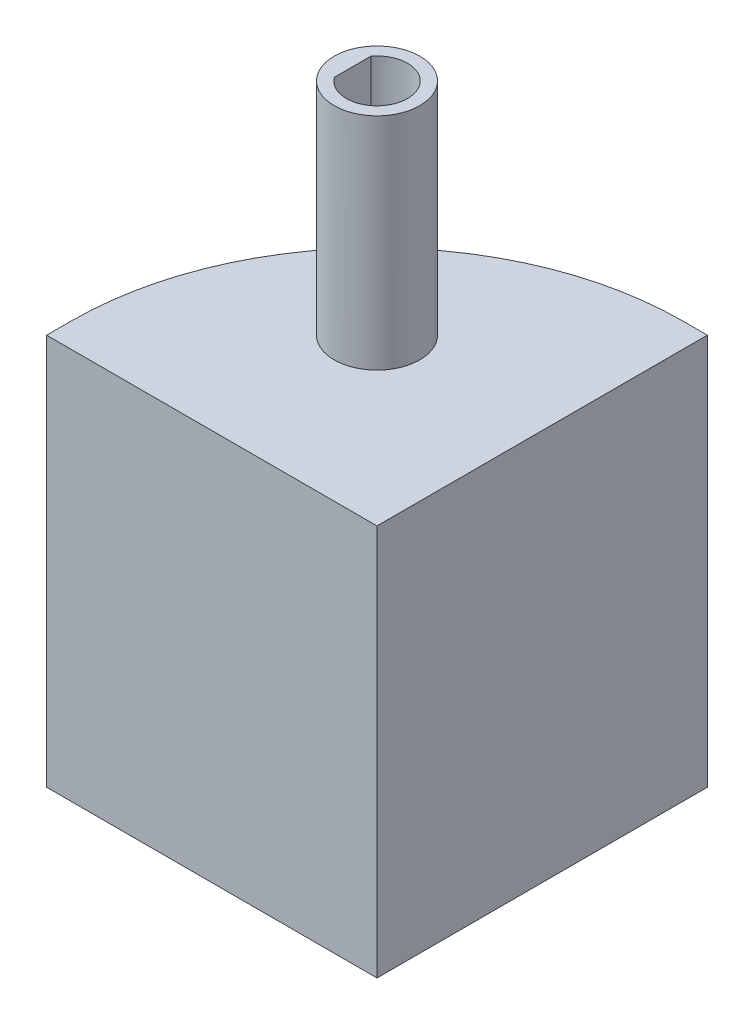
ISO-10303-21;
HEADER;
FILE_DESCRIPTION(('STEP AP214'),'2;1');
FILE_NAME('part.step','',(''),(''),'','','');
FILE_SCHEMA(('AUTOMOTIVE_DESIGN { 1 0 10303 214 1 1 1 1 }'));
ENDSEC;
DATA;
#1=APPLICATION_CONTEXT('core data for automotive mechanical design processes');
#2=APPLICATION_PROTOCOL_DEFINITION('international standard','automotive_design',2000,#1);
#3=PRODUCT_CONTEXT('',#1,'mechanical');
#4=PRODUCT('Part','Part','',(#3));
#5=PRODUCT_RELATED_PRODUCT_CATEGORY('part','',(#4));
#6=PRODUCT_DEFINITION_FORMATION('','',#4);
#7=PRODUCT_DEFINITION_CONTEXT('part definition',#1,'design');
#8=PRODUCT_DEFINITION('design','',#6,#7);
#9=PRODUCT_DEFINITION_SHAPE('','',#8);
#10=(LENGTH_UNIT() NAMED_UNIT(*) SI_UNIT(.MILLI.,.METRE.));
#11=(NAMED_UNIT(*) PLANE_ANGLE_UNIT() SI_UNIT($,.RADIAN.));
#12=(NAMED_UNIT(*) SI_UNIT($,.STERADIAN.) SOLID_ANGLE_UNIT());
#13=UNCERTAINTY_MEASURE_WITH_UNIT(LENGTH_MEASURE(1.E-05),#10,'distance_accuracy_value','');
#14=(GEOMETRIC_REPRESENTATION_CONTEXT(3) GLOBAL_UNCERTAINTY_ASSIGNED_CONTEXT((#13)) GLOBAL_UNIT_ASSIGNED_CONTEXT((#10,
#11,#12)) REPRESENTATION_CONTEXT('',''));
#15=CARTESIAN_POINT('',(0.,0.,0.));
#16=DIRECTION('',(0.,0.,1.));
#17=DIRECTION('',(1.,0.,0.));
#18=AXIS2_PLACEMENT_3D('',#15,#16,#17);
#19=CARTESIAN_POINT('',(0.,32.,0.));
#20=DIRECTION('',(0.,-1.,0.));
#21=DIRECTION('',(0.,0.,-1.));
#22=AXIS2_PLACEMENT_3D('',#19,#20,#21);
#23=PLANE('',#22);
#24=DIRECTION('',(1.,0.,0.));
#25=VECTOR('',#24,1.);
#26=CARTESIAN_POINT('',(27.,32.,-25.));
#27=LINE('',#26,#25);
#28=CARTESIAN_POINT('',(25.,32.,-25.));
#29=VERTEX_POINT('',#28);
#30=CARTESIAN_POINT('',(27.,32.,-25.));
#31=VERTEX_POINT('',#30);
#32=EDGE_CURVE('E186',#29,#31,#27,.T.);
#33=ORIENTED_EDGE('',*,*,#32,.F.);
#34=CARTESIAN_POINT('',(25.0000000000001,32.,0.));
#35=DIRECTION('',(0.,1.,0.));
#36=DIRECTION('',(0.,0.,-1.));
#37=AXIS2_PLACEMENT_3D('',#34,#35,#36);
#38=CIRCLE('',#37,25.0000000000001);
#39=CARTESIAN_POINT('',(0.,32.,0.));
#40=VERTEX_POINT('',#39);
#41=EDGE_CURVE('E175',#29,#40,#38,.T.);
#42=ORIENTED_EDGE('',*,*,#41,.T.);
#43=DIRECTION('',(0.,0.,-1.));
#44=VECTOR('',#43,1.);
#45=CARTESIAN_POINT('',(0.,32.,0.));
#46=LINE('',#45,#44);
#47=CARTESIAN_POINT('',(0.,32.,2.));
#48=VERTEX_POINT('',#47);
#49=EDGE_CURVE('E196',#48,#40,#46,.T.);
#50=ORIENTED_EDGE('',*,*,#49,.F.);
#51=DIRECTION('',(-1.,0.,0.));
#52=VECTOR('',#51,1.);
#53=CARTESIAN_POINT('',(0.,32.,2.));
#54=LINE('',#53,#52);
#55=CARTESIAN_POINT('',(27.,32.,2.));
#56=VERTEX_POINT('',#55);
#57=EDGE_CURVE('E193',#56,#48,#54,.T.);
#58=ORIENTED_EDGE('',*,*,#57,.F.);
#59=DIRECTION('',(0.,0.,1.));
#60=VECTOR('',#59,1.);
#61=CARTESIAN_POINT('',(27.,32.,2.));
#62=LINE('',#61,#60);
#63=EDGE_CURVE('E189',#31,#56,#62,.T.);
#64=ORIENTED_EDGE('',*,*,#63,.F.);
#65=EDGE_LOOP('',(#33,#42,#50,#58,#64));
#66=FACE_BOUND('',#65,.T.);
#67=CARTESIAN_POINT('',(13.5,32.,-11.5));
#68=DIRECTION('',(0.,-1.,0.));
#69=DIRECTION('',(0.,0.,-1.));
#70=AXIS2_PLACEMENT_3D('',#67,#68,#69);
#71=CIRCLE('',#70,3.5);
#72=CARTESIAN_POINT('',(13.5,32.,-15.));
#73=VERTEX_POINT('',#72);
#74=EDGE_CURVE('E12',#73,#73,#71,.F.);
#75=ORIENTED_EDGE('',*,*,#74,.F.);
#76=EDGE_LOOP('',(#75));
#77=FACE_BOUND('',#76,.T.);
#78=ADVANCED_FACE('F57',(#66,#77),#23,.F.);
#79=CARTESIAN_POINT('',(0.,0.,-25.));
#80=DIRECTION('',(0.,-1.,0.));
#81=DIRECTION('',(0.,0.,-1.));
#82=AXIS2_PLACEMENT_3D('',#79,#80,#81);
#83=PLANE('',#82);
#84=CARTESIAN_POINT('',(12.5,0.,-12.5));
#85=DIRECTION('',(0.,1.,0.));
#86=DIRECTION('',(0.,0.,1.));
#87=AXIS2_PLACEMENT_3D('',#84,#85,#86);
#88=CIRCLE('',#87,6.0005);
#89=CARTESIAN_POINT('',(12.5,0.,-6.4995));
#90=VERTEX_POINT('',#89);
#91=EDGE_CURVE('E219',#90,#90,#88,.T.);
#92=ORIENTED_EDGE('',*,*,#91,.T.);
#93=EDGE_LOOP('',(#92));
#94=FACE_BOUND('',#93,.T.);
#95=DIRECTION('',(1.,0.,0.));
#96=VECTOR('',#95,1.);
#97=CARTESIAN_POINT('',(0.,0.,-7.5));
#98=LINE('',#97,#96);
#99=CARTESIAN_POINT('',(0.,0.,-7.5));
#100=VERTEX_POINT('',#99);
#101=CARTESIAN_POINT('',(3.83974596215561,0.,-7.5));
#102=VERTEX_POINT('',#101);
#103=EDGE_CURVE('E231',#100,#102,#98,.T.);
#104=ORIENTED_EDGE('',*,*,#103,.T.);
#105=CARTESIAN_POINT('',(12.5,0.,-12.5));
#106=DIRECTION('',(0.,1.,0.));
#107=DIRECTION('',(0.,0.,1.));
#108=AXIS2_PLACEMENT_3D('',#105,#106,#107);
#109=CIRCLE('',#108,10.);
#110=CARTESIAN_POINT('',(12.5,0.,-22.5));
#111=VERTEX_POINT('',#110);
#112=EDGE_CURVE('E225',#111,#102,#109,.T.);
#113=ORIENTED_EDGE('',*,*,#112,.F.);
#114=DIRECTION('',(0.,0.,-1.));
#115=VECTOR('',#114,1.);
#116=CARTESIAN_POINT('',(12.5,0.,0.));
#117=LINE('',#116,#115);
#118=CARTESIAN_POINT('',(12.5,0.,-25.));
#119=VERTEX_POINT('',#118);
#120=EDGE_CURVE('E227',#111,#119,#117,.T.);
#121=ORIENTED_EDGE('',*,*,#120,.T.);
#122=DIRECTION('',(1.,0.,0.));
#123=VECTOR('',#122,1.);
#124=CARTESIAN_POINT('',(0.,0.,-25.));
#125=LINE('',#124,#123);
#126=CARTESIAN_POINT('',(27.,0.,-25.));
#127=VERTEX_POINT('',#126);
#128=EDGE_CURVE('E250',#119,#127,#125,.T.);
#129=ORIENTED_EDGE('',*,*,#128,.T.);
#130=DIRECTION('',(0.,0.,1.));
#131=VECTOR('',#130,1.);
#132=CARTESIAN_POINT('',(27.,0.,2.));
#133=LINE('',#132,#131);
#134=CARTESIAN_POINT('',(27.,0.,2.));
#135=VERTEX_POINT('',#134);
#136=EDGE_CURVE('E183',#127,#135,#133,.T.);
#137=ORIENTED_EDGE('',*,*,#136,.T.);
#138=DIRECTION('',(-1.,0.,0.));
#139=VECTOR('',#138,1.);
#140=CARTESIAN_POINT('',(0.,0.,2.));
#141=LINE('',#140,#139);
#142=CARTESIAN_POINT('',(0.,0.,2.));
#143=VERTEX_POINT('',#142);
#144=EDGE_CURVE('E190',#135,#143,#141,.T.);
#145=ORIENTED_EDGE('',*,*,#144,.T.);
#146=DIRECTION('',(0.,0.,1.));
#147=VECTOR('',#146,1.);
#148=CARTESIAN_POINT('',(0.,0.,-25.));
#149=LINE('',#148,#147);
#150=EDGE_CURVE('E65',#100,#143,#149,.T.);
#151=ORIENTED_EDGE('',*,*,#150,.F.);
#152=EDGE_LOOP('',(#104,#113,#121,#129,#137,#145,#151));
#153=FACE_BOUND('',#152,.T.);
#154=ADVANCED_FACE('F59',(#94,#153),#83,.T.);
#155=CARTESIAN_POINT('',(0.,0.,-25.));
#156=DIRECTION('',(1.,0.,0.));
#157=DIRECTION('',(0.,0.,-1.));
#158=AXIS2_PLACEMENT_3D('',#155,#156,#157);
#159=PLANE('',#158);
#160=DIRECTION('',(0.,0.,1.));
#161=VECTOR('',#160,1.);
#162=CARTESIAN_POINT('',(0.,2.,-25.));
#163=LINE('',#162,#161);
#164=CARTESIAN_POINT('',(0.,2.,-7.5));
#165=VERTEX_POINT('',#164);
#166=CARTESIAN_POINT('',(0.,2.,0.));
#167=VERTEX_POINT('',#166);
#168=EDGE_CURVE('E259',#165,#167,#163,.T.);
#169=ORIENTED_EDGE('',*,*,#168,.F.);
#170=DIRECTION('',(0.,1.,0.));
#171=VECTOR('',#170,1.);
#172=CARTESIAN_POINT('',(0.,0.,-7.5));
#173=LINE('',#172,#171);
#174=EDGE_CURVE('E244',#100,#165,#173,.T.);
#175=ORIENTED_EDGE('',*,*,#174,.F.);
#176=ORIENTED_EDGE('',*,*,#150,.T.);
#177=DIRECTION('',(0.,-1.,0.));
#178=VECTOR('',#177,1.);
#179=CARTESIAN_POINT('',(0.,32.,2.));
#180=LINE('',#179,#178);
#181=EDGE_CURVE('E206',#48,#143,#180,.T.);
#182=ORIENTED_EDGE('',*,*,#181,.F.);
#183=ORIENTED_EDGE('',*,*,#49,.T.);
#184=DIRECTION('',(0.,-1.,0.));
#185=VECTOR('',#184,1.);
#186=CARTESIAN_POINT('',(0.,32.,0.));
#187=LINE('',#186,#185);
#188=CARTESIAN_POINT('',(0.,30.,0.));
#189=VERTEX_POINT('',#188);
#190=EDGE_CURVE('E203',#40,#189,#187,.T.);
#191=ORIENTED_EDGE('',*,*,#190,.T.);
#192=EDGE_CURVE('E80',#189,#167,#187,.T.);
#193=ORIENTED_EDGE('',*,*,#192,.T.);
#194=EDGE_LOOP('',(#169,#175,#176,#182,#183,#191,#193));
#195=FACE_BOUND('',#194,.T.);
#196=ADVANCED_FACE('F310',(#195),#159,.F.);
#197=CARTESIAN_POINT('',(0.,2.,-25.));
#198=DIRECTION('',(0.,-1.,0.));
#199=DIRECTION('',(0.,0.,-1.));
#200=AXIS2_PLACEMENT_3D('',#197,#198,#199);
#201=PLANE('',#200);
#202=CARTESIAN_POINT('',(12.5,2.,-12.5));
#203=DIRECTION('',(0.,1.,0.));
#204=DIRECTION('',(0.,0.,1.));
#205=AXIS2_PLACEMENT_3D('',#202,#203,#204);
#206=CIRCLE('',#205,6.0005);
#207=CARTESIAN_POINT('',(12.5,2.,-6.4995));
#208=VERTEX_POINT('',#207);
#209=EDGE_CURVE('E205',#208,#208,#206,.T.);
#210=ORIENTED_EDGE('',*,*,#209,.F.);
#211=EDGE_LOOP('',(#210));
#212=FACE_BOUND('',#211,.T.);
#213=CARTESIAN_POINT('',(12.5,2.,-12.5));
#214=DIRECTION('',(0.,1.,0.));
#215=DIRECTION('',(0.,0.,1.));
#216=AXIS2_PLACEMENT_3D('',#213,#214,#215);
#217=CIRCLE('',#216,10.);
#218=CARTESIAN_POINT('',(12.5,2.,-22.5));
#219=VERTEX_POINT('',#218);
#220=CARTESIAN_POINT('',(3.83974596215561,2.,-7.5));
#221=VERTEX_POINT('',#220);
#222=EDGE_CURVE('E222',#219,#221,#217,.T.);
#223=ORIENTED_EDGE('',*,*,#222,.T.);
#224=DIRECTION('',(1.,0.,0.));
#225=VECTOR('',#224,1.);
#226=CARTESIAN_POINT('',(0.,2.,-7.5));
#227=LINE('',#226,#225);
#228=EDGE_CURVE('E228',#165,#221,#227,.T.);
#229=ORIENTED_EDGE('',*,*,#228,.F.);
#230=ORIENTED_EDGE('',*,*,#168,.T.);
#231=DIRECTION('',(1.,0.,0.));
#232=VECTOR('',#231,1.);
#233=CARTESIAN_POINT('',(0.,2.,0.));
#234=LINE('',#233,#232);
#235=CARTESIAN_POINT('',(25.,2.,0.));
#236=VERTEX_POINT('',#235);
#237=EDGE_CURVE('E243',#167,#236,#234,.T.);
#238=ORIENTED_EDGE('',*,*,#237,.T.);
#239=DIRECTION('',(0.,0.,1.));
#240=VECTOR('',#239,1.);
#241=CARTESIAN_POINT('',(25.,2.,-25.));
#242=LINE('',#241,#240);
#243=CARTESIAN_POINT('',(25.,2.,-25.));
#244=VERTEX_POINT('',#243);
#245=EDGE_CURVE('E255',#244,#236,#242,.T.);
#246=ORIENTED_EDGE('',*,*,#245,.F.);
#247=DIRECTION('',(1.,0.,0.));
#248=VECTOR('',#247,1.);
#249=CARTESIAN_POINT('',(0.,2.,-25.));
#250=LINE('',#249,#248);
#251=CARTESIAN_POINT('',(12.5,2.,-25.));
#252=VERTEX_POINT('',#251);
#253=EDGE_CURVE('E252',#252,#244,#250,.T.);
#254=ORIENTED_EDGE('',*,*,#253,.F.);
#255=DIRECTION('',(0.,0.,-1.));
#256=VECTOR('',#255,1.);
#257=CARTESIAN_POINT('',(12.5,2.,0.));
#258=LINE('',#257,#256);
#259=EDGE_CURVE('E237',#219,#252,#258,.T.);
#260=ORIENTED_EDGE('',*,*,#259,.F.);
#261=EDGE_LOOP('',(#223,#229,#230,#238,#246,#254,#260));
#262=FACE_BOUND('',#261,.T.);
#263=ADVANCED_FACE('F270',(#212,#262),#201,.F.);
#264=CARTESIAN_POINT('',(0.,0.,-25.));
#265=DIRECTION('',(0.,0.,-1.));
#266=DIRECTION('',(-1.,0.,0.));
#267=AXIS2_PLACEMENT_3D('',#264,#265,#266);
#268=PLANE('',#267);
#269=DIRECTION('',(0.,1.,0.));
#270=VECTOR('',#269,1.);
#271=CARTESIAN_POINT('',(12.5,0.,-25.));
#272=LINE('',#271,#270);
#273=EDGE_CURVE('E246',#119,#252,#272,.T.);
#274=ORIENTED_EDGE('',*,*,#273,.T.);
#275=ORIENTED_EDGE('',*,*,#253,.T.);
#276=DIRECTION('',(0.,-1.,0.));
#277=VECTOR('',#276,1.);
#278=CARTESIAN_POINT('',(25.,32.,-25.));
#279=LINE('',#278,#277);
#280=CARTESIAN_POINT('',(25.,30.,-25.));
#281=VERTEX_POINT('',#280);
#282=EDGE_CURVE('E217',#281,#244,#279,.T.);
#283=ORIENTED_EDGE('',*,*,#282,.F.);
#284=EDGE_CURVE('E214',#29,#281,#279,.T.);
#285=ORIENTED_EDGE('',*,*,#284,.F.);
#286=ORIENTED_EDGE('',*,*,#32,.T.);
#287=DIRECTION('',(0.,-1.,0.));
#288=VECTOR('',#287,1.);
#289=CARTESIAN_POINT('',(27.,32.,-25.));
#290=LINE('',#289,#288);
#291=EDGE_CURVE('E211',#31,#127,#290,.T.);
#292=ORIENTED_EDGE('',*,*,#291,.T.);
#293=ORIENTED_EDGE('',*,*,#128,.F.);
#294=EDGE_LOOP('',(#274,#275,#283,#285,#286,#292,#293));
#295=FACE_BOUND('',#294,.T.);
#296=ADVANCED_FACE('F285',(#295),#268,.T.);
#297=CARTESIAN_POINT('',(12.5,0.,-12.5));
#298=DIRECTION('',(0.,1.,0.));
#299=DIRECTION('',(0.,0.,1.));
#300=AXIS2_PLACEMENT_3D('',#297,#298,#299);
#301=CYLINDRICAL_SURFACE('',#300,10.);
#302=ORIENTED_EDGE('',*,*,#222,.F.);
#303=DIRECTION('',(0.,1.,0.));
#304=VECTOR('',#303,1.);
#305=CARTESIAN_POINT('',(12.5,0.,-22.5));
#306=LINE('',#305,#304);
#307=EDGE_CURVE('E234',#111,#219,#306,.T.);
#308=ORIENTED_EDGE('',*,*,#307,.F.);
#309=ORIENTED_EDGE('',*,*,#112,.T.);
#310=DIRECTION('',(0.,1.,0.));
#311=VECTOR('',#310,1.);
#312=CARTESIAN_POINT('',(3.83974596215561,0.,-7.5));
#313=LINE('',#312,#311);
#314=EDGE_CURVE('E241',#102,#221,#313,.T.);
#315=ORIENTED_EDGE('',*,*,#314,.T.);
#316=EDGE_LOOP('',(#302,#308,#309,#315));
#317=FACE_BOUND('',#316,.T.);
#318=ADVANCED_FACE('F303',(#317),#301,.T.);
#319=CARTESIAN_POINT('',(0.,0.,-7.5));
#320=DIRECTION('',(0.,0.,1.));
#321=DIRECTION('',(1.,0.,0.));
#322=AXIS2_PLACEMENT_3D('',#319,#320,#321);
#323=PLANE('',#322);
#324=ORIENTED_EDGE('',*,*,#228,.T.);
#325=ORIENTED_EDGE('',*,*,#314,.F.);
#326=ORIENTED_EDGE('',*,*,#103,.F.);
#327=ORIENTED_EDGE('',*,*,#174,.T.);
#328=EDGE_LOOP('',(#324,#325,#326,#327));
#329=FACE_BOUND('',#328,.T.);
#330=ADVANCED_FACE('F306',(#329),#323,.F.);
#331=CARTESIAN_POINT('',(12.5,0.,0.));
#332=DIRECTION('',(1.,0.,0.));
#333=DIRECTION('',(0.,0.,-1.));
#334=AXIS2_PLACEMENT_3D('',#331,#332,#333);
#335=PLANE('',#334);
#336=ORIENTED_EDGE('',*,*,#259,.T.);
#337=ORIENTED_EDGE('',*,*,#273,.F.);
#338=ORIENTED_EDGE('',*,*,#120,.F.);
#339=ORIENTED_EDGE('',*,*,#307,.T.);
#340=EDGE_LOOP('',(#336,#337,#338,#339));
#341=FACE_BOUND('',#340,.T.);
#342=ADVANCED_FACE('F300',(#341),#335,.F.);
#343=CARTESIAN_POINT('',(12.5,0.,-12.5));
#344=DIRECTION('',(0.,1.,0.));
#345=DIRECTION('',(0.,0.,1.));
#346=AXIS2_PLACEMENT_3D('',#343,#344,#345);
#347=CYLINDRICAL_SURFACE('',#346,6.0005);
#348=ORIENTED_EDGE('',*,*,#91,.F.);
#349=EDGE_LOOP('',(#348));
#350=FACE_BOUND('',#349,.T.);
#351=ORIENTED_EDGE('',*,*,#209,.T.);
#352=EDGE_LOOP('',(#351));
#353=FACE_BOUND('',#352,.T.);
#354=ADVANCED_FACE('F421',(#350,#353),#347,.F.);
#355=CARTESIAN_POINT('',(0.,32.,0.));
#356=DIRECTION('',(0.,0.,-1.));
#357=DIRECTION('',(-1.,0.,0.));
#358=AXIS2_PLACEMENT_3D('',#355,#356,#357);
#359=PLANE('',#358);
#360=DIRECTION('',(1.,0.,0.));
#361=VECTOR('',#360,1.);
#362=CARTESIAN_POINT('',(0.,30.,0.));
#363=LINE('',#362,#361);
#364=CARTESIAN_POINT('',(25.,30.,0.));
#365=VERTEX_POINT('',#364);
#366=EDGE_CURVE('E179',#189,#365,#363,.T.);
#367=ORIENTED_EDGE('',*,*,#366,.T.);
#368=DIRECTION('',(0.,-1.,0.));
#369=VECTOR('',#368,1.);
#370=CARTESIAN_POINT('',(25.,32.,0.));
#371=LINE('',#370,#369);
#372=EDGE_CURVE('E198',#365,#236,#371,.T.);
#373=ORIENTED_EDGE('',*,*,#372,.T.);
#374=ORIENTED_EDGE('',*,*,#237,.F.);
#375=ORIENTED_EDGE('',*,*,#192,.F.);
#376=EDGE_LOOP('',(#367,#373,#374,#375));
#377=FACE_BOUND('',#376,.T.);
#378=ADVANCED_FACE('F274',(#377),#359,.T.);
#379=CARTESIAN_POINT('',(25.,32.,-25.));
#380=DIRECTION('',(-1.,0.,0.));
#381=DIRECTION('',(0.,0.,1.));
#382=AXIS2_PLACEMENT_3D('',#379,#380,#381);
#383=PLANE('',#382);
#384=DIRECTION('',(0.,0.,-1.));
#385=VECTOR('',#384,1.);
#386=CARTESIAN_POINT('',(25.,30.,0.));
#387=LINE('',#386,#385);
#388=EDGE_CURVE('E181',#365,#281,#387,.T.);
#389=ORIENTED_EDGE('',*,*,#388,.T.);
#390=ORIENTED_EDGE('',*,*,#282,.T.);
#391=ORIENTED_EDGE('',*,*,#245,.T.);
#392=ORIENTED_EDGE('',*,*,#372,.F.);
#393=EDGE_LOOP('',(#389,#390,#391,#392));
#394=FACE_BOUND('',#393,.T.);
#395=ADVANCED_FACE('F265',(#394),#383,.T.);
#396=CARTESIAN_POINT('',(0.,32.,2.));
#397=DIRECTION('',(0.,0.,1.));
#398=DIRECTION('',(1.,0.,0.));
#399=AXIS2_PLACEMENT_3D('',#396,#397,#398);
#400=PLANE('',#399);
#401=ORIENTED_EDGE('',*,*,#144,.F.);
#402=DIRECTION('',(0.,-1.,0.));
#403=VECTOR('',#402,1.);
#404=CARTESIAN_POINT('',(27.,32.,2.));
#405=LINE('',#404,#403);
#406=EDGE_CURVE('E209',#56,#135,#405,.T.);
#407=ORIENTED_EDGE('',*,*,#406,.F.);
#408=ORIENTED_EDGE('',*,*,#57,.T.);
#409=ORIENTED_EDGE('',*,*,#181,.T.);
#410=EDGE_LOOP('',(#401,#407,#408,#409));
#411=FACE_BOUND('',#410,.T.);
#412=ADVANCED_FACE('F312',(#411),#400,.T.);
#413=CARTESIAN_POINT('',(27.,32.,2.));
#414=DIRECTION('',(1.,0.,0.));
#415=DIRECTION('',(0.,0.,-1.));
#416=AXIS2_PLACEMENT_3D('',#413,#414,#415);
#417=PLANE('',#416);
#418=ORIENTED_EDGE('',*,*,#136,.F.);
#419=ORIENTED_EDGE('',*,*,#291,.F.);
#420=ORIENTED_EDGE('',*,*,#63,.T.);
#421=ORIENTED_EDGE('',*,*,#406,.T.);
#422=EDGE_LOOP('',(#418,#419,#420,#421));
#423=FACE_BOUND('',#422,.T.);
#424=ADVANCED_FACE('F293',(#423),#417,.T.);
#425=CARTESIAN_POINT('',(25.0000000000001,30.,0.));
#426=DIRECTION('',(0.,1.,0.));
#427=DIRECTION('',(0.,0.,1.));
#428=AXIS2_PLACEMENT_3D('',#425,#426,#427);
#429=CYLINDRICAL_SURFACE('',#428,25.0000000000001);
#430=ORIENTED_EDGE('',*,*,#41,.F.);
#431=ORIENTED_EDGE('',*,*,#284,.T.);
#432=CARTESIAN_POINT('',(25.0000000000001,30.,0.));
#433=DIRECTION('',(0.,1.,0.));
#434=DIRECTION('',(0.,0.,-1.));
#435=AXIS2_PLACEMENT_3D('',#432,#433,#434);
#436=CIRCLE('',#435,25.0000000000001);
#437=EDGE_CURVE('E176',#281,#189,#436,.T.);
#438=ORIENTED_EDGE('',*,*,#437,.T.);
#439=ORIENTED_EDGE('',*,*,#190,.F.);
#440=EDGE_LOOP('',(#430,#431,#438,#439));
#441=FACE_BOUND('',#440,.T.);
#442=ADVANCED_FACE('F282',(#441),#429,.T.);
#443=CARTESIAN_POINT('',(25.0000000000001,30.,0.));
#444=DIRECTION('',(0.,-1.,0.));
#445=DIRECTION('',(0.,0.,-1.));
#446=AXIS2_PLACEMENT_3D('',#443,#444,#445);
#447=PLANE('',#446);
#448=ORIENTED_EDGE('',*,*,#437,.F.);
#449=ORIENTED_EDGE('',*,*,#388,.F.);
#450=ORIENTED_EDGE('',*,*,#366,.F.);
#451=EDGE_LOOP('',(#448,#449,#450));
#452=FACE_BOUND('',#451,.T.);
#453=ADVANCED_FACE('F278',(#452),#447,.T.);
#454=CARTESIAN_POINT('',(13.5,50.,-11.5));
#455=DIRECTION('',(0.,1.,0.));
#456=DIRECTION('',(0.,0.,1.));
#457=AXIS2_PLACEMENT_3D('',#454,#455,#456);
#458=PLANE('',#457);
#459=CARTESIAN_POINT('',(13.5,50.,-11.5));
#460=DIRECTION('',(0.,1.,0.));
#461=DIRECTION('',(0.,0.,1.));
#462=AXIS2_PLACEMENT_3D('',#459,#460,#461);
#463=CIRCLE('',#462,3.5);
#464=CARTESIAN_POINT('',(13.5,50.,-8.));
#465=VERTEX_POINT('',#464);
#466=EDGE_CURVE('E172',#465,#465,#463,.T.);
#467=ORIENTED_EDGE('',*,*,#466,.T.);
#468=EDGE_LOOP('',(#467));
#469=FACE_BOUND('',#468,.T.);
#470=DIRECTION('',(0.,0.,1.));
#471=VECTOR('',#470,1.);
#472=CARTESIAN_POINT('',(11.5,50.,-13.));
#473=LINE('',#472,#471);
#474=CARTESIAN_POINT('',(11.5,50.,-13.));
#475=VERTEX_POINT('',#474);
#476=CARTESIAN_POINT('',(11.5,50.,-10.));
#477=VERTEX_POINT('',#476);
#478=EDGE_CURVE('E150',#475,#477,#473,.T.);
#479=ORIENTED_EDGE('',*,*,#478,.F.);
#480=CARTESIAN_POINT('',(13.5,50.,-11.5));
#481=DIRECTION('',(0.,1.,0.));
#482=DIRECTION('',(0.,0.,1.));
#483=AXIS2_PLACEMENT_3D('',#480,#481,#482);
#484=CIRCLE('',#483,2.5);
#485=EDGE_CURVE('E157',#477,#475,#484,.T.);
#486=ORIENTED_EDGE('',*,*,#485,.F.);
#487=EDGE_LOOP('',(#479,#486));
#488=FACE_BOUND('',#487,.T.);
#489=ADVANCED_FACE('F165',(#469,#488),#458,.T.);
#490=CARTESIAN_POINT('',(13.5,50.,-11.5));
#491=DIRECTION('',(0.,-1.,0.));
#492=DIRECTION('',(0.,0.,-1.));
#493=AXIS2_PLACEMENT_3D('',#490,#491,#492);
#494=CYLINDRICAL_SURFACE('',#493,3.5);
#495=ORIENTED_EDGE('',*,*,#466,.F.);
#496=EDGE_LOOP('',(#495));
#497=FACE_BOUND('',#496,.T.);
#498=ORIENTED_EDGE('',*,*,#74,.T.);
#499=EDGE_LOOP('',(#498));
#500=FACE_BOUND('',#499,.T.);
#501=ADVANCED_FACE('F339',(#497,#500),#494,.T.);
#502=CARTESIAN_POINT('',(13.5,50.,-11.5));
#503=DIRECTION('',(0.,-1.,0.));
#504=DIRECTION('',(0.,0.,-1.));
#505=AXIS2_PLACEMENT_3D('',#502,#503,#504);
#506=CYLINDRICAL_SURFACE('',#505,2.5);
#507=CARTESIAN_POINT('',(13.5,32.,-11.5));
#508=DIRECTION('',(0.,1.,0.));
#509=DIRECTION('',(0.,0.,1.));
#510=AXIS2_PLACEMENT_3D('',#507,#508,#509);
#511=CIRCLE('',#510,2.5);
#512=CARTESIAN_POINT('',(11.5,32.,-10.));
#513=VERTEX_POINT('',#512);
#514=CARTESIAN_POINT('',(11.5,32.,-13.));
#515=VERTEX_POINT('',#514);
#516=EDGE_CURVE('E162',#513,#515,#511,.T.);
#517=ORIENTED_EDGE('',*,*,#516,.F.);
#518=DIRECTION('',(0.,-1.,0.));
#519=VECTOR('',#518,1.);
#520=CARTESIAN_POINT('',(11.5,50.,-10.));
#521=LINE('',#520,#519);
#522=EDGE_CURVE('E72',#477,#513,#521,.T.);
#523=ORIENTED_EDGE('',*,*,#522,.F.);
#524=ORIENTED_EDGE('',*,*,#485,.T.);
#525=DIRECTION('',(0.,-1.,0.));
#526=VECTOR('',#525,1.);
#527=CARTESIAN_POINT('',(11.5,50.,-13.));
#528=LINE('',#527,#526);
#529=EDGE_CURVE('E153',#475,#515,#528,.T.);
#530=ORIENTED_EDGE('',*,*,#529,.T.);
#531=EDGE_LOOP('',(#517,#523,#524,#530));
#532=FACE_BOUND('',#531,.T.);
#533=ADVANCED_FACE('F160',(#532),#506,.F.);
#534=CARTESIAN_POINT('',(11.5,50.,-13.));
#535=DIRECTION('',(1.,0.,0.));
#536=DIRECTION('',(0.,0.,-1.));
#537=AXIS2_PLACEMENT_3D('',#534,#535,#536);
#538=PLANE('',#537);
#539=DIRECTION('',(0.,0.,1.));
#540=VECTOR('',#539,1.);
#541=CARTESIAN_POINT('',(11.5,32.,-13.));
#542=LINE('',#541,#540);
#543=EDGE_CURVE('E166',#515,#513,#542,.T.);
#544=ORIENTED_EDGE('',*,*,#543,.F.);
#545=ORIENTED_EDGE('',*,*,#529,.F.);
#546=ORIENTED_EDGE('',*,*,#478,.T.);
#547=ORIENTED_EDGE('',*,*,#522,.T.);
#548=EDGE_LOOP('',(#544,#545,#546,#547));
#549=FACE_BOUND('',#548,.T.);
#550=ADVANCED_FACE('F151',(#549),#538,.T.);
#551=ORIENTED_EDGE('',*,*,#543,.T.);
#552=ORIENTED_EDGE('',*,*,#516,.T.);
#553=EDGE_LOOP('',(#551,#552));
#554=FACE_BOUND('',#553,.T.);
#555=ADVANCED_FACE('F323',(#554),#23,.F.);
#556=CLOSED_SHELL('',(#78,#154,#196,#263,#296,#318,#330,#342,#354,#378,#395,#412,#424,#442,#453,
#489,#501,#533,#550,#555));
#557=MANIFOLD_SOLID_BREP('B2',#556);
#558=ADVANCED_BREP_SHAPE_REPRESENTATION('',(#18,#557),#14);
#559=SHAPE_DEFINITION_REPRESENTATION(#9,#558);
ENDSEC;
END-ISO-10303-21;
